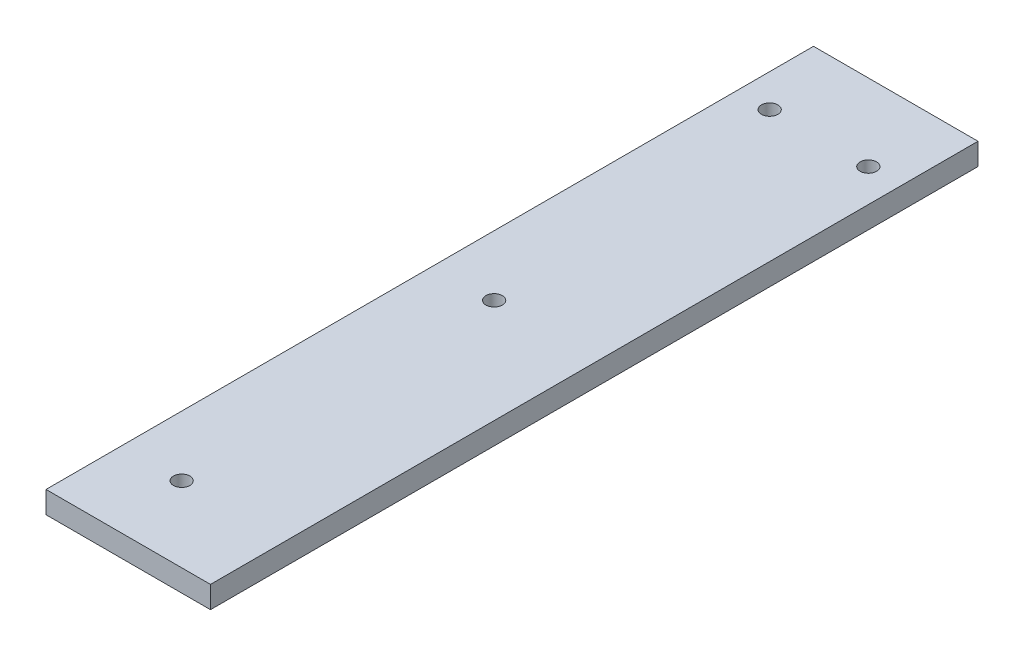
ISO-10303-21;
HEADER;
FILE_DESCRIPTION(('STEP AP214'),'2;1');
FILE_NAME('part.step','',(''),(''),'','','');
FILE_SCHEMA(('AUTOMOTIVE_DESIGN { 1 0 10303 214 1 1 1 1 }'));
ENDSEC;
DATA;
#1=APPLICATION_CONTEXT('core data for automotive mechanical design processes');
#2=APPLICATION_PROTOCOL_DEFINITION('international standard','automotive_design',2000,#1);
#3=PRODUCT_CONTEXT('',#1,'mechanical');
#4=PRODUCT('Part','Part','',(#3));
#5=PRODUCT_RELATED_PRODUCT_CATEGORY('part','',(#4));
#6=PRODUCT_DEFINITION_FORMATION('','',#4);
#7=PRODUCT_DEFINITION_CONTEXT('part definition',#1,'design');
#8=PRODUCT_DEFINITION('design','',#6,#7);
#9=PRODUCT_DEFINITION_SHAPE('','',#8);
#10=(LENGTH_UNIT() NAMED_UNIT(*) SI_UNIT(.MILLI.,.METRE.));
#11=(NAMED_UNIT(*) PLANE_ANGLE_UNIT() SI_UNIT($,.RADIAN.));
#12=(NAMED_UNIT(*) SI_UNIT($,.STERADIAN.) SOLID_ANGLE_UNIT());
#13=UNCERTAINTY_MEASURE_WITH_UNIT(LENGTH_MEASURE(1.E-05),#10,'distance_accuracy_value','');
#14=(GEOMETRIC_REPRESENTATION_CONTEXT(3) GLOBAL_UNCERTAINTY_ASSIGNED_CONTEXT((#13)) GLOBAL_UNIT_ASSIGNED_CONTEXT((#10,
#11,#12)) REPRESENTATION_CONTEXT('',''));
#15=CARTESIAN_POINT('',(0.,0.,0.));
#16=DIRECTION('',(0.,0.,1.));
#17=DIRECTION('',(1.,0.,0.));
#18=AXIS2_PLACEMENT_3D('',#15,#16,#17);
#19=CARTESIAN_POINT('',(15.,0.,70.));
#20=DIRECTION('',(-1.,0.,0.));
#21=DIRECTION('',(0.,0.,1.));
#22=AXIS2_PLACEMENT_3D('',#19,#20,#21);
#23=PLANE('',#22);
#24=DIRECTION('',(0.,1.,0.));
#25=VECTOR('',#24,1.);
#26=CARTESIAN_POINT('',(15.,0.,0.));
#27=LINE('',#26,#25);
#28=CARTESIAN_POINT('',(15.,0.,0.));
#29=VERTEX_POINT('',#28);
#30=CARTESIAN_POINT('',(15.,2.,0.));
#31=VERTEX_POINT('',#30);
#32=EDGE_CURVE('E105',#29,#31,#27,.T.);
#33=ORIENTED_EDGE('',*,*,#32,.T.);
#34=DIRECTION('',(0.,0.,-1.));
#35=VECTOR('',#34,1.);
#36=CARTESIAN_POINT('',(15.,2.,70.));
#37=LINE('',#36,#35);
#38=CARTESIAN_POINT('',(15.,2.,70.));
#39=VERTEX_POINT('',#38);
#40=EDGE_CURVE('E11',#39,#31,#37,.T.);
#41=ORIENTED_EDGE('',*,*,#40,.F.);
#42=DIRECTION('',(0.,1.,0.));
#43=VECTOR('',#42,1.);
#44=CARTESIAN_POINT('',(15.,0.,70.));
#45=LINE('',#44,#43);
#46=CARTESIAN_POINT('',(15.,0.,70.));
#47=VERTEX_POINT('',#46);
#48=EDGE_CURVE('E89',#47,#39,#45,.T.);
#49=ORIENTED_EDGE('',*,*,#48,.F.);
#50=DIRECTION('',(0.,0.,-1.));
#51=VECTOR('',#50,1.);
#52=CARTESIAN_POINT('',(15.,0.,70.));
#53=LINE('',#52,#51);
#54=EDGE_CURVE('E98',#47,#29,#53,.T.);
#55=ORIENTED_EDGE('',*,*,#54,.T.);
#56=EDGE_LOOP('',(#33,#41,#49,#55));
#57=FACE_BOUND('',#56,.T.);
#58=ADVANCED_FACE('F39',(#57),#23,.F.);
#59=CARTESIAN_POINT('',(15.,2.,70.));
#60=DIRECTION('',(0.,-1.,0.));
#61=DIRECTION('',(1.,0.,0.));
#62=AXIS2_PLACEMENT_3D('',#59,#60,#61);
#63=PLANE('',#62);
#64=CARTESIAN_POINT('',(12.,2.,7.00000000000001));
#65=DIRECTION('',(0.,1.,0.));
#66=DIRECTION('',(-1.,0.,0.));
#67=AXIS2_PLACEMENT_3D('',#64,#65,#66);
#68=CIRCLE('',#67,0.75);
#69=CARTESIAN_POINT('',(11.25,2.,7.00000000000001));
#70=VERTEX_POINT('',#69);
#71=EDGE_CURVE('E131',#70,#70,#68,.T.);
#72=ORIENTED_EDGE('',*,*,#71,.F.);
#73=EDGE_LOOP('',(#72));
#74=FACE_BOUND('',#73,.T.);
#75=CARTESIAN_POINT('',(3.,2.,7.00000000000001));
#76=DIRECTION('',(0.,1.,0.));
#77=DIRECTION('',(-1.,0.,0.));
#78=AXIS2_PLACEMENT_3D('',#75,#76,#77);
#79=CIRCLE('',#78,0.75);
#80=CARTESIAN_POINT('',(2.25,2.,7.00000000000001));
#81=VERTEX_POINT('',#80);
#82=EDGE_CURVE('E132',#81,#81,#79,.T.);
#83=ORIENTED_EDGE('',*,*,#82,.F.);
#84=EDGE_LOOP('',(#83));
#85=FACE_BOUND('',#84,.T.);
#86=CARTESIAN_POINT('',(5.49999999999999,2.,34.6286340467035));
#87=DIRECTION('',(0.,1.,0.));
#88=DIRECTION('',(-1.,0.,0.));
#89=AXIS2_PLACEMENT_3D('',#86,#87,#88);
#90=CIRCLE('',#89,0.75);
#91=CARTESIAN_POINT('',(4.74999999999999,2.,34.6286340467035));
#92=VERTEX_POINT('',#91);
#93=EDGE_CURVE('E124',#92,#92,#90,.T.);
#94=ORIENTED_EDGE('',*,*,#93,.F.);
#95=EDGE_LOOP('',(#94));
#96=FACE_BOUND('',#95,.T.);
#97=CARTESIAN_POINT('',(5.50000000000003,2.,63.1286340467035));
#98=DIRECTION('',(0.,1.,0.));
#99=DIRECTION('',(-1.,0.,0.));
#100=AXIS2_PLACEMENT_3D('',#97,#98,#99);
#101=CIRCLE('',#100,0.75);
#102=CARTESIAN_POINT('',(4.75000000000003,2.,63.1286340467035));
#103=VERTEX_POINT('',#102);
#104=EDGE_CURVE('E116',#103,#103,#101,.T.);
#105=ORIENTED_EDGE('',*,*,#104,.F.);
#106=EDGE_LOOP('',(#105));
#107=FACE_BOUND('',#106,.T.);
#108=DIRECTION('',(-1.,0.,0.));
#109=VECTOR('',#108,1.);
#110=CARTESIAN_POINT('',(15.,2.,0.));
#111=LINE('',#110,#109);
#112=CARTESIAN_POINT('',(0.,2.,0.));
#113=VERTEX_POINT('',#112);
#114=EDGE_CURVE('E94',#31,#113,#111,.T.);
#115=ORIENTED_EDGE('',*,*,#114,.T.);
#116=DIRECTION('',(0.,0.,-1.));
#117=VECTOR('',#116,1.);
#118=CARTESIAN_POINT('',(0.,2.,70.));
#119=LINE('',#118,#117);
#120=CARTESIAN_POINT('',(0.,2.,70.));
#121=VERTEX_POINT('',#120);
#122=EDGE_CURVE('E50',#121,#113,#119,.T.);
#123=ORIENTED_EDGE('',*,*,#122,.F.);
#124=DIRECTION('',(-1.,0.,0.));
#125=VECTOR('',#124,1.);
#126=CARTESIAN_POINT('',(15.,2.,70.));
#127=LINE('',#126,#125);
#128=EDGE_CURVE('E84',#39,#121,#127,.T.);
#129=ORIENTED_EDGE('',*,*,#128,.F.);
#130=ORIENTED_EDGE('',*,*,#40,.T.);
#131=EDGE_LOOP('',(#115,#123,#129,#130));
#132=FACE_BOUND('',#131,.T.);
#133=ADVANCED_FACE('F91',(#74,#85,#96,#107,#132),#63,.F.);
#134=CARTESIAN_POINT('',(0.,0.,70.));
#135=DIRECTION('',(1.,0.,0.));
#136=DIRECTION('',(0.,0.,-1.));
#137=AXIS2_PLACEMENT_3D('',#134,#135,#136);
#138=PLANE('',#137);
#139=DIRECTION('',(0.,-1.,0.));
#140=VECTOR('',#139,1.);
#141=CARTESIAN_POINT('',(0.,0.,0.));
#142=LINE('',#141,#140);
#143=CARTESIAN_POINT('',(0.,0.,0.));
#144=VERTEX_POINT('',#143);
#145=EDGE_CURVE('E75',#113,#144,#142,.T.);
#146=ORIENTED_EDGE('',*,*,#145,.T.);
#147=DIRECTION('',(0.,0.,-1.));
#148=VECTOR('',#147,1.);
#149=CARTESIAN_POINT('',(0.,0.,70.));
#150=LINE('',#149,#148);
#151=CARTESIAN_POINT('',(0.,0.,70.));
#152=VERTEX_POINT('',#151);
#153=EDGE_CURVE('E92',#152,#144,#150,.T.);
#154=ORIENTED_EDGE('',*,*,#153,.F.);
#155=DIRECTION('',(0.,-1.,0.));
#156=VECTOR('',#155,1.);
#157=CARTESIAN_POINT('',(0.,0.,70.));
#158=LINE('',#157,#156);
#159=EDGE_CURVE('E86',#121,#152,#158,.T.);
#160=ORIENTED_EDGE('',*,*,#159,.F.);
#161=ORIENTED_EDGE('',*,*,#122,.T.);
#162=EDGE_LOOP('',(#146,#154,#160,#161));
#163=FACE_BOUND('',#162,.T.);
#164=ADVANCED_FACE('F96',(#163),#138,.F.);
#165=CARTESIAN_POINT('',(15.,0.,70.));
#166=DIRECTION('',(0.,1.,0.));
#167=DIRECTION('',(-1.,0.,0.));
#168=AXIS2_PLACEMENT_3D('',#165,#166,#167);
#169=PLANE('',#168);
#170=CARTESIAN_POINT('',(12.,0.,7.00000000000001));
#171=DIRECTION('',(0.,1.,0.));
#172=DIRECTION('',(-1.,0.,0.));
#173=AXIS2_PLACEMENT_3D('',#170,#171,#172);
#174=CIRCLE('',#173,0.75);
#175=CARTESIAN_POINT('',(11.25,0.,7.00000000000001));
#176=VERTEX_POINT('',#175);
#177=EDGE_CURVE('E104',#176,#176,#174,.T.);
#178=ORIENTED_EDGE('',*,*,#177,.T.);
#179=EDGE_LOOP('',(#178));
#180=FACE_BOUND('',#179,.T.);
#181=CARTESIAN_POINT('',(3.,0.,7.00000000000001));
#182=DIRECTION('',(0.,1.,0.));
#183=DIRECTION('',(-1.,0.,0.));
#184=AXIS2_PLACEMENT_3D('',#181,#182,#183);
#185=CIRCLE('',#184,0.75);
#186=CARTESIAN_POINT('',(2.25,0.,7.00000000000001));
#187=VERTEX_POINT('',#186);
#188=EDGE_CURVE('E126',#187,#187,#185,.T.);
#189=ORIENTED_EDGE('',*,*,#188,.T.);
#190=EDGE_LOOP('',(#189));
#191=FACE_BOUND('',#190,.T.);
#192=CARTESIAN_POINT('',(5.49999999999999,0.,34.6286340467035));
#193=DIRECTION('',(0.,1.,0.));
#194=DIRECTION('',(-1.,0.,0.));
#195=AXIS2_PLACEMENT_3D('',#192,#193,#194);
#196=CIRCLE('',#195,0.75);
#197=CARTESIAN_POINT('',(4.74999999999999,0.,34.6286340467035));
#198=VERTEX_POINT('',#197);
#199=EDGE_CURVE('E125',#198,#198,#196,.T.);
#200=ORIENTED_EDGE('',*,*,#199,.T.);
#201=EDGE_LOOP('',(#200));
#202=FACE_BOUND('',#201,.T.);
#203=CARTESIAN_POINT('',(5.50000000000003,0.,63.1286340467035));
#204=DIRECTION('',(0.,1.,0.));
#205=DIRECTION('',(-1.,0.,0.));
#206=AXIS2_PLACEMENT_3D('',#203,#204,#205);
#207=CIRCLE('',#206,0.75);
#208=CARTESIAN_POINT('',(4.75000000000003,0.,63.1286340467035));
#209=VERTEX_POINT('',#208);
#210=EDGE_CURVE('E117',#209,#209,#207,.T.);
#211=ORIENTED_EDGE('',*,*,#210,.T.);
#212=EDGE_LOOP('',(#211));
#213=FACE_BOUND('',#212,.T.);
#214=DIRECTION('',(1.,0.,0.));
#215=VECTOR('',#214,1.);
#216=CARTESIAN_POINT('',(15.,0.,0.));
#217=LINE('',#216,#215);
#218=EDGE_CURVE('E79',#144,#29,#217,.T.);
#219=ORIENTED_EDGE('',*,*,#218,.T.);
#220=ORIENTED_EDGE('',*,*,#54,.F.);
#221=DIRECTION('',(1.,0.,0.));
#222=VECTOR('',#221,1.);
#223=CARTESIAN_POINT('',(15.,0.,70.));
#224=LINE('',#223,#222);
#225=EDGE_CURVE('E54',#152,#47,#224,.T.);
#226=ORIENTED_EDGE('',*,*,#225,.F.);
#227=ORIENTED_EDGE('',*,*,#153,.T.);
#228=EDGE_LOOP('',(#219,#220,#226,#227));
#229=FACE_BOUND('',#228,.T.);
#230=ADVANCED_FACE('F109',(#180,#191,#202,#213,#229),#169,.F.);
#231=CARTESIAN_POINT('',(0.,0.,70.));
#232=DIRECTION('',(0.,0.,1.));
#233=DIRECTION('',(1.,0.,0.));
#234=AXIS2_PLACEMENT_3D('',#231,#232,#233);
#235=PLANE('',#234);
#236=ORIENTED_EDGE('',*,*,#48,.T.);
#237=ORIENTED_EDGE('',*,*,#128,.T.);
#238=ORIENTED_EDGE('',*,*,#159,.T.);
#239=ORIENTED_EDGE('',*,*,#225,.T.);
#240=EDGE_LOOP('',(#236,#237,#238,#239));
#241=FACE_BOUND('',#240,.T.);
#242=ADVANCED_FACE('F88',(#241),#235,.T.);
#243=CARTESIAN_POINT('',(0.,0.,0.));
#244=DIRECTION('',(0.,0.,1.));
#245=DIRECTION('',(1.,0.,0.));
#246=AXIS2_PLACEMENT_3D('',#243,#244,#245);
#247=PLANE('',#246);
#248=ORIENTED_EDGE('',*,*,#32,.F.);
#249=ORIENTED_EDGE('',*,*,#218,.F.);
#250=ORIENTED_EDGE('',*,*,#145,.F.);
#251=ORIENTED_EDGE('',*,*,#114,.F.);
#252=EDGE_LOOP('',(#248,#249,#250,#251));
#253=FACE_BOUND('',#252,.T.);
#254=ADVANCED_FACE('F114',(#253),#247,.F.);
#255=CARTESIAN_POINT('',(5.50000000000003,0.,63.1286340467035));
#256=DIRECTION('',(0.,1.,0.));
#257=DIRECTION('',(-1.,0.,0.));
#258=AXIS2_PLACEMENT_3D('',#255,#256,#257);
#259=CYLINDRICAL_SURFACE('',#258,0.75);
#260=ORIENTED_EDGE('',*,*,#210,.F.);
#261=EDGE_LOOP('',(#260));
#262=FACE_BOUND('',#261,.T.);
#263=ORIENTED_EDGE('',*,*,#104,.T.);
#264=EDGE_LOOP('',(#263));
#265=FACE_BOUND('',#264,.T.);
#266=ADVANCED_FACE('F160',(#262,#265),#259,.F.);
#267=CARTESIAN_POINT('',(5.49999999999999,0.,34.6286340467035));
#268=DIRECTION('',(0.,1.,0.));
#269=DIRECTION('',(-1.,0.,0.));
#270=AXIS2_PLACEMENT_3D('',#267,#268,#269);
#271=CYLINDRICAL_SURFACE('',#270,0.75);
#272=ORIENTED_EDGE('',*,*,#199,.F.);
#273=EDGE_LOOP('',(#272));
#274=FACE_BOUND('',#273,.T.);
#275=ORIENTED_EDGE('',*,*,#93,.T.);
#276=EDGE_LOOP('',(#275));
#277=FACE_BOUND('',#276,.T.);
#278=ADVANCED_FACE('F157',(#274,#277),#271,.F.);
#279=CARTESIAN_POINT('',(3.,0.,7.00000000000001));
#280=DIRECTION('',(0.,1.,0.));
#281=DIRECTION('',(-1.,0.,0.));
#282=AXIS2_PLACEMENT_3D('',#279,#280,#281);
#283=CYLINDRICAL_SURFACE('',#282,0.75);
#284=ORIENTED_EDGE('',*,*,#188,.F.);
#285=EDGE_LOOP('',(#284));
#286=FACE_BOUND('',#285,.T.);
#287=ORIENTED_EDGE('',*,*,#82,.T.);
#288=EDGE_LOOP('',(#287));
#289=FACE_BOUND('',#288,.T.);
#290=ADVANCED_FACE('F144',(#286,#289),#283,.F.);
#291=CARTESIAN_POINT('',(12.,0.,7.00000000000001));
#292=DIRECTION('',(0.,1.,0.));
#293=DIRECTION('',(-1.,0.,0.));
#294=AXIS2_PLACEMENT_3D('',#291,#292,#293);
#295=CYLINDRICAL_SURFACE('',#294,0.75);
#296=ORIENTED_EDGE('',*,*,#177,.F.);
#297=EDGE_LOOP('',(#296));
#298=FACE_BOUND('',#297,.T.);
#299=ORIENTED_EDGE('',*,*,#71,.T.);
#300=EDGE_LOOP('',(#299));
#301=FACE_BOUND('',#300,.T.);
#302=ADVANCED_FACE('F142',(#298,#301),#295,.F.);
#303=CLOSED_SHELL('',(#58,#133,#164,#230,#242,#254,#266,#278,#290,#302));
#304=MANIFOLD_SOLID_BREP('B2',#303);
#305=ADVANCED_BREP_SHAPE_REPRESENTATION('',(#18,#304),#14);
#306=SHAPE_DEFINITION_REPRESENTATION(#9,#305);
ENDSEC;
END-ISO-10303-21;
